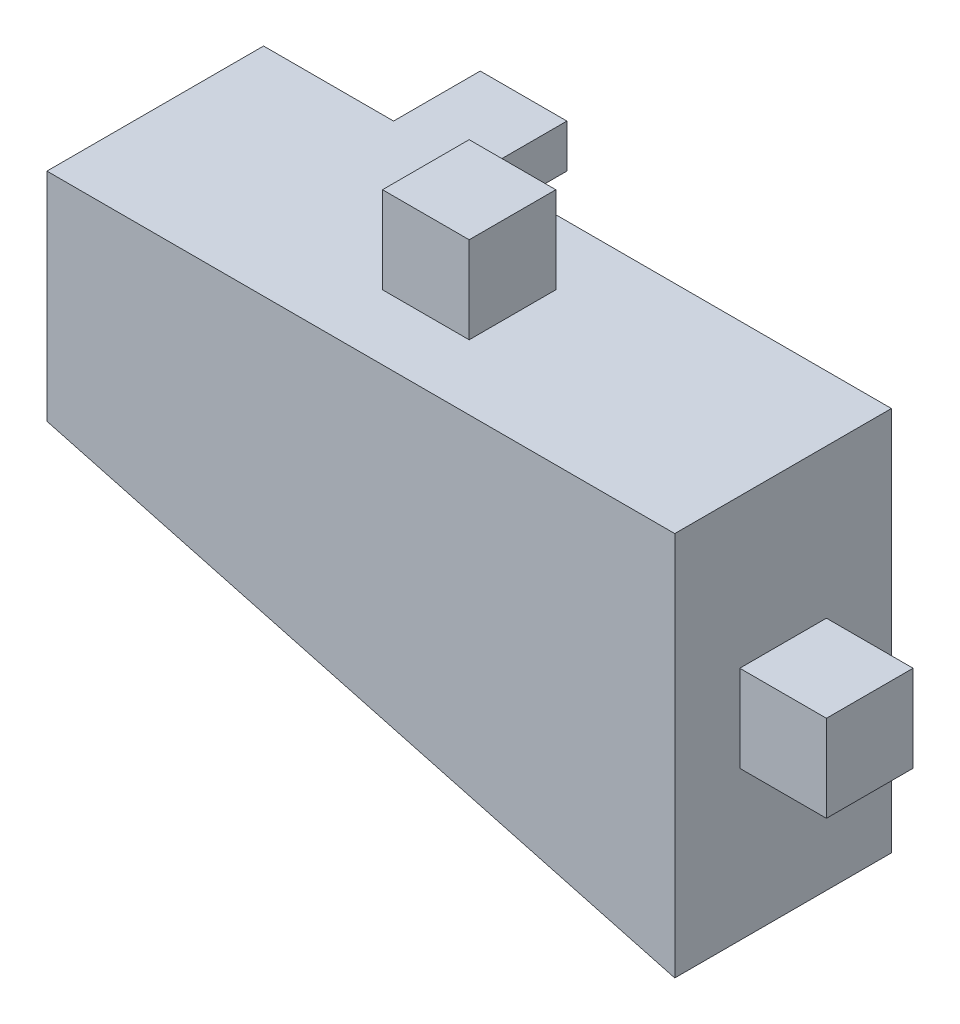
ISO-10303-21;
HEADER;
FILE_DESCRIPTION(('STEP AP214'),'2;1');
FILE_NAME('part.step','',(''),(''),'','','');
FILE_SCHEMA(('AUTOMOTIVE_DESIGN { 1 0 10303 214 1 1 1 1 }'));
ENDSEC;
DATA;
#1=APPLICATION_CONTEXT('core data for automotive mechanical design processes');
#2=APPLICATION_PROTOCOL_DEFINITION('international standard','automotive_design',2000,#1);
#3=PRODUCT_CONTEXT('',#1,'mechanical');
#4=PRODUCT('Part','Part','',(#3));
#5=PRODUCT_RELATED_PRODUCT_CATEGORY('part','',(#4));
#6=PRODUCT_DEFINITION_FORMATION('','',#4);
#7=PRODUCT_DEFINITION_CONTEXT('part definition',#1,'design');
#8=PRODUCT_DEFINITION('design','',#6,#7);
#9=PRODUCT_DEFINITION_SHAPE('','',#8);
#10=(LENGTH_UNIT() NAMED_UNIT(*) SI_UNIT(.MILLI.,.METRE.));
#11=(NAMED_UNIT(*) PLANE_ANGLE_UNIT() SI_UNIT($,.RADIAN.));
#12=(NAMED_UNIT(*) SI_UNIT($,.STERADIAN.) SOLID_ANGLE_UNIT());
#13=UNCERTAINTY_MEASURE_WITH_UNIT(LENGTH_MEASURE(1.E-05),#10,'distance_accuracy_value','');
#14=(GEOMETRIC_REPRESENTATION_CONTEXT(3) GLOBAL_UNCERTAINTY_ASSIGNED_CONTEXT((#13)) GLOBAL_UNIT_ASSIGNED_CONTEXT((#10,
#11,#12)) REPRESENTATION_CONTEXT('',''));
#15=CARTESIAN_POINT('',(0.,0.,0.));
#16=DIRECTION('',(0.,0.,1.));
#17=DIRECTION('',(1.,0.,0.));
#18=AXIS2_PLACEMENT_3D('',#15,#16,#17);
#19=CARTESIAN_POINT('',(110.57764421791,0.,0.));
#20=DIRECTION('',(-1.,0.,0.));
#21=DIRECTION('',(0.,-1.,0.));
#22=AXIS2_PLACEMENT_3D('',#19,#20,#21);
#23=PLANE('',#22);
#24=DIRECTION('',(0.,-1.,0.));
#25=VECTOR('',#24,1.);
#26=CARTESIAN_POINT('',(110.57764421791,31.6424845178765,50.));
#27=LINE('',#26,#25);
#28=CARTESIAN_POINT('',(110.57764421791,-18.2414554532318,50.));
#29=VERTEX_POINT('',#28);
#30=CARTESIAN_POINT('',(110.57764421791,-107.064312218609,50.));
#31=VERTEX_POINT('',#30);
#32=EDGE_CURVE('E47',#29,#31,#27,.T.);
#33=ORIENTED_EDGE('',*,*,#32,.T.);
#34=DIRECTION('',(0.,0.,-1.));
#35=VECTOR('',#34,1.);
#36=CARTESIAN_POINT('',(110.57764421791,-107.064312218609,50.));
#37=LINE('',#36,#35);
#38=CARTESIAN_POINT('',(110.57764421791,-107.064312218609,0.));
#39=VERTEX_POINT('',#38);
#40=EDGE_CURVE('E11',#31,#39,#37,.T.);
#41=ORIENTED_EDGE('',*,*,#40,.T.);
#42=DIRECTION('',(0.,-1.,0.));
#43=VECTOR('',#42,1.);
#44=CARTESIAN_POINT('',(110.57764421791,31.7585445467682,0.));
#45=LINE('',#44,#43);
#46=CARTESIAN_POINT('',(110.57764421791,-18.2414554532318,0.));
#47=VERTEX_POINT('',#46);
#48=EDGE_CURVE('E260',#47,#39,#45,.T.);
#49=ORIENTED_EDGE('',*,*,#48,.F.);
#50=DIRECTION('',(0.,0.,-1.));
#51=VECTOR('',#50,1.);
#52=CARTESIAN_POINT('',(110.57764421791,-18.2414554532318,0.));
#53=LINE('',#52,#51);
#54=EDGE_CURVE('E42',#29,#47,#53,.T.);
#55=ORIENTED_EDGE('',*,*,#54,.F.);
#56=EDGE_LOOP('',(#33,#41,#49,#55));
#57=FACE_BOUND('',#56,.T.);
#58=DIRECTION('',(0.,-1.,0.));
#59=VECTOR('',#58,1.);
#60=CARTESIAN_POINT('',(110.57764421791,-52.6528838359203,35.0000000000001));
#61=LINE('',#60,#59);
#62=CARTESIAN_POINT('',(110.57764421791,-52.6528838359203,35.0000000000001));
#63=VERTEX_POINT('',#62);
#64=CARTESIAN_POINT('',(110.57764421791,-72.6528838359204,35.0000000000001));
#65=VERTEX_POINT('',#64);
#66=EDGE_CURVE('E55',#63,#65,#61,.T.);
#67=ORIENTED_EDGE('',*,*,#66,.F.);
#68=DIRECTION('',(0.,0.,1.));
#69=VECTOR('',#68,1.);
#70=CARTESIAN_POINT('',(110.57764421791,-52.6528838359203,35.0000000000001));
#71=LINE('',#70,#69);
#72=CARTESIAN_POINT('',(110.57764421791,-52.6528838359203,15.0000000000001));
#73=VERTEX_POINT('',#72);
#74=EDGE_CURVE('E59',#73,#63,#71,.T.);
#75=ORIENTED_EDGE('',*,*,#74,.F.);
#76=DIRECTION('',(0.,1.,0.));
#77=VECTOR('',#76,1.);
#78=CARTESIAN_POINT('',(110.57764421791,-52.6528838359203,15.0000000000001));
#79=LINE('',#78,#77);
#80=CARTESIAN_POINT('',(110.57764421791,-72.6528838359204,15.0000000000001));
#81=VERTEX_POINT('',#80);
#82=EDGE_CURVE('E462',#81,#73,#79,.T.);
#83=ORIENTED_EDGE('',*,*,#82,.F.);
#84=DIRECTION('',(0.,0.,-1.));
#85=VECTOR('',#84,1.);
#86=CARTESIAN_POINT('',(110.57764421791,-72.6528838359204,35.0000000000001));
#87=LINE('',#86,#85);
#88=EDGE_CURVE('E468',#65,#81,#87,.T.);
#89=ORIENTED_EDGE('',*,*,#88,.F.);
#90=EDGE_LOOP('',(#67,#75,#83,#89));
#91=FACE_BOUND('',#90,.T.);
#92=ADVANCED_FACE('F39',(#57,#91),#23,.F.);
#93=CARTESIAN_POINT('',(45.6887702745492,31.6424845178765,50.));
#94=DIRECTION('',(0.,0.,1.));
#95=DIRECTION('',(1.,0.,0.));
#96=AXIS2_PLACEMENT_3D('',#93,#94,#95);
#97=PLANE('',#96);
#98=ORIENTED_EDGE('',*,*,#32,.F.);
#99=DIRECTION('',(1.,0.,0.));
#100=VECTOR('',#99,1.);
#101=CARTESIAN_POINT('',(45.6887702745492,-18.2414554532318,50.));
#102=LINE('',#101,#100);
#103=CARTESIAN_POINT('',(-34.3112297254508,-18.2414554532318,50.));
#104=VERTEX_POINT('',#103);
#105=EDGE_CURVE('E257',#104,#29,#102,.T.);
#106=ORIENTED_EDGE('',*,*,#105,.F.);
#107=DIRECTION('',(0.,1.,0.));
#108=VECTOR('',#107,1.);
#109=CARTESIAN_POINT('',(-34.3112297254508,-68.2414554532319,50.));
#110=LINE('',#109,#108);
#111=CARTESIAN_POINT('',(-34.3112297254508,-68.2414554532319,50.));
#112=VERTEX_POINT('',#111);
#113=EDGE_CURVE('E239',#112,#104,#110,.T.);
#114=ORIENTED_EDGE('',*,*,#113,.F.);
#115=DIRECTION('',(-0.96592582628907,0.258819045102514,0.));
#116=VECTOR('',#115,1.);
#117=CARTESIAN_POINT('',(-34.3112297254508,-68.2414554532319,50.));
#118=LINE('',#117,#116);
#119=EDGE_CURVE('E248',#31,#112,#118,.T.);
#120=ORIENTED_EDGE('',*,*,#119,.F.);
#121=EDGE_LOOP('',(#98,#106,#114,#120));
#122=FACE_BOUND('',#121,.T.);
#123=ADVANCED_FACE('F299',(#122),#97,.T.);
#124=CARTESIAN_POINT('',(-34.3112297254508,-68.3575154821235,750.));
#125=DIRECTION('',(1.,0.,0.));
#126=DIRECTION('',(0.,1.,0.));
#127=AXIS2_PLACEMENT_3D('',#124,#125,#126);
#128=PLANE('',#127);
#129=ORIENTED_EDGE('',*,*,#113,.T.);
#130=DIRECTION('',(0.,0.,-1.));
#131=VECTOR('',#130,1.);
#132=CARTESIAN_POINT('',(-34.3112297254508,-18.2414554532318,750.));
#133=LINE('',#132,#131);
#134=CARTESIAN_POINT('',(-34.3112297254508,-18.2414554532318,0.));
#135=VERTEX_POINT('',#134);
#136=EDGE_CURVE('E255',#104,#135,#133,.T.);
#137=ORIENTED_EDGE('',*,*,#136,.T.);
#138=DIRECTION('',(0.,-1.,0.));
#139=VECTOR('',#138,1.);
#140=CARTESIAN_POINT('',(-34.3112297254508,31.7585445467682,0.));
#141=LINE('',#140,#139);
#142=CARTESIAN_POINT('',(-34.3112297254508,-68.2414554532319,0.));
#143=VERTEX_POINT('',#142);
#144=EDGE_CURVE('E245',#135,#143,#141,.T.);
#145=ORIENTED_EDGE('',*,*,#144,.T.);
#146=DIRECTION('',(0.,0.,1.));
#147=VECTOR('',#146,1.);
#148=CARTESIAN_POINT('',(-34.3112297254508,-68.2414554532319,0.));
#149=LINE('',#148,#147);
#150=EDGE_CURVE('E242',#143,#112,#149,.T.);
#151=ORIENTED_EDGE('',*,*,#150,.T.);
#152=EDGE_LOOP('',(#129,#137,#145,#151));
#153=FACE_BOUND('',#152,.T.);
#154=ADVANCED_FACE('F294',(#153),#128,.F.);
#155=CARTESIAN_POINT('',(-34.3112297254508,-68.2414554532319,50.));
#156=DIRECTION('',(-0.258819045102514,-0.96592582628907,0.));
#157=DIRECTION('',(0.96592582628907,-0.258819045102514,0.));
#158=AXIS2_PLACEMENT_3D('',#155,#156,#157);
#159=PLANE('',#158);
#160=ORIENTED_EDGE('',*,*,#40,.F.);
#161=ORIENTED_EDGE('',*,*,#119,.T.);
#162=ORIENTED_EDGE('',*,*,#150,.F.);
#163=DIRECTION('',(-0.96592582628907,0.258819045102514,0.));
#164=VECTOR('',#163,1.);
#165=CARTESIAN_POINT('',(-34.3112297254508,-68.2414554532319,0.));
#166=LINE('',#165,#164);
#167=EDGE_CURVE('E249',#39,#143,#166,.T.);
#168=ORIENTED_EDGE('',*,*,#167,.F.);
#169=EDGE_LOOP('',(#160,#161,#162,#168));
#170=FACE_BOUND('',#169,.T.);
#171=ADVANCED_FACE('F296',(#170),#159,.T.);
#172=CARTESIAN_POINT('',(0.,-18.2414554532318,0.));
#173=DIRECTION('',(0.,-1.,0.));
#174=DIRECTION('',(1.,0.,0.));
#175=AXIS2_PLACEMENT_3D('',#172,#173,#174);
#176=PLANE('',#175);
#177=DIRECTION('',(1.,0.,0.));
#178=VECTOR('',#177,1.);
#179=CARTESIAN_POINT('',(0.,-18.2414554532318,15.));
#180=LINE('',#179,#178);
#181=CARTESIAN_POINT('',(28.1332072462295,-18.2414554532318,15.));
#182=VERTEX_POINT('',#181);
#183=CARTESIAN_POINT('',(48.1332072462295,-18.2414554532318,15.));
#184=VERTEX_POINT('',#183);
#185=EDGE_CURVE('E221',#182,#184,#180,.T.);
#186=ORIENTED_EDGE('',*,*,#185,.T.);
#187=DIRECTION('',(0.,0.,1.));
#188=VECTOR('',#187,1.);
#189=CARTESIAN_POINT('',(48.1332072462295,-18.2414554532318,0.));
#190=LINE('',#189,#188);
#191=CARTESIAN_POINT('',(48.1332072462295,-18.2414554532318,35.));
#192=VERTEX_POINT('',#191);
#193=EDGE_CURVE('E207',#184,#192,#190,.T.);
#194=ORIENTED_EDGE('',*,*,#193,.T.);
#195=DIRECTION('',(1.,0.,0.));
#196=VECTOR('',#195,1.);
#197=CARTESIAN_POINT('',(0.,-18.2414554532318,35.));
#198=LINE('',#197,#196);
#199=CARTESIAN_POINT('',(28.1332072462295,-18.2414554532318,35.));
#200=VERTEX_POINT('',#199);
#201=EDGE_CURVE('E212',#200,#192,#198,.T.);
#202=ORIENTED_EDGE('',*,*,#201,.F.);
#203=DIRECTION('',(0.,0.,1.));
#204=VECTOR('',#203,1.);
#205=CARTESIAN_POINT('',(28.1332072462295,-18.2414554532318,0.));
#206=LINE('',#205,#204);
#207=EDGE_CURVE('E223',#182,#200,#206,.T.);
#208=ORIENTED_EDGE('',*,*,#207,.F.);
#209=EDGE_LOOP('',(#186,#194,#202,#208));
#210=FACE_BOUND('',#209,.T.);
#211=ORIENTED_EDGE('',*,*,#105,.T.);
#212=ORIENTED_EDGE('',*,*,#54,.T.);
#213=DIRECTION('',(1.,0.,0.));
#214=VECTOR('',#213,1.);
#215=CARTESIAN_POINT('',(-34.3112297254508,-18.2414554532318,0.));
#216=LINE('',#215,#214);
#217=CARTESIAN_POINT('',(15.6887702745492,-18.2414554532318,0.));
#218=VERTEX_POINT('',#217);
#219=EDGE_CURVE('E251',#218,#47,#216,.T.);
#220=ORIENTED_EDGE('',*,*,#219,.F.);
#221=DIRECTION('',(0.,0.,1.));
#222=VECTOR('',#221,1.);
#223=CARTESIAN_POINT('',(15.6887702745492,-18.2414554532318,-20.));
#224=LINE('',#223,#222);
#225=CARTESIAN_POINT('',(15.6887702745492,-18.2414554532318,-20.));
#226=VERTEX_POINT('',#225);
#227=EDGE_CURVE('E201',#226,#218,#224,.T.);
#228=ORIENTED_EDGE('',*,*,#227,.F.);
#229=DIRECTION('',(1.,0.,0.));
#230=VECTOR('',#229,1.);
#231=CARTESIAN_POINT('',(0.,-18.2414554532318,-20.));
#232=LINE('',#231,#230);
#233=CARTESIAN_POINT('',(-4.31122972545079,-18.2414554532318,-20.));
#234=VERTEX_POINT('',#233);
#235=EDGE_CURVE('E184',#234,#226,#232,.T.);
#236=ORIENTED_EDGE('',*,*,#235,.F.);
#237=DIRECTION('',(0.,0.,1.));
#238=VECTOR('',#237,1.);
#239=CARTESIAN_POINT('',(-4.31122972545079,-18.2414554532318,-20.));
#240=LINE('',#239,#238);
#241=CARTESIAN_POINT('',(-4.3112297254508,-18.2414554532318,0.));
#242=VERTEX_POINT('',#241);
#243=EDGE_CURVE('E204',#234,#242,#240,.T.);
#244=ORIENTED_EDGE('',*,*,#243,.T.);
#245=EDGE_CURVE('E253',#135,#242,#216,.T.);
#246=ORIENTED_EDGE('',*,*,#245,.F.);
#247=ORIENTED_EDGE('',*,*,#136,.F.);
#248=EDGE_LOOP('',(#211,#212,#220,#228,#236,#244,#246,#247));
#249=FACE_BOUND('',#248,.T.);
#250=ADVANCED_FACE('F269',(#210,#249),#176,.F.);
#251=CARTESIAN_POINT('',(-34.3112297254508,31.7585445467682,0.));
#252=DIRECTION('',(0.,0.,1.));
#253=DIRECTION('',(1.,0.,0.));
#254=AXIS2_PLACEMENT_3D('',#251,#252,#253);
#255=PLANE('',#254);
#256=ORIENTED_EDGE('',*,*,#245,.T.);
#257=DIRECTION('',(0.,-1.,0.));
#258=VECTOR('',#257,1.);
#259=CARTESIAN_POINT('',(-4.31122972545079,0.,0.));
#260=LINE('',#259,#258);
#261=CARTESIAN_POINT('',(-4.3112297254508,-28.2414554532318,0.));
#262=VERTEX_POINT('',#261);
#263=EDGE_CURVE('E173',#242,#262,#260,.T.);
#264=ORIENTED_EDGE('',*,*,#263,.T.);
#265=DIRECTION('',(-1.,0.,0.));
#266=VECTOR('',#265,1.);
#267=CARTESIAN_POINT('',(0.,-28.2414554532318,0.));
#268=LINE('',#267,#266);
#269=CARTESIAN_POINT('',(15.6887702745492,-28.2414554532318,0.));
#270=VERTEX_POINT('',#269);
#271=EDGE_CURVE('E185',#270,#262,#268,.T.);
#272=ORIENTED_EDGE('',*,*,#271,.F.);
#273=DIRECTION('',(0.,-1.,0.));
#274=VECTOR('',#273,1.);
#275=CARTESIAN_POINT('',(15.6887702745492,0.,0.));
#276=LINE('',#275,#274);
#277=EDGE_CURVE('E175',#218,#270,#276,.T.);
#278=ORIENTED_EDGE('',*,*,#277,.F.);
#279=ORIENTED_EDGE('',*,*,#219,.T.);
#280=ORIENTED_EDGE('',*,*,#48,.T.);
#281=ORIENTED_EDGE('',*,*,#167,.T.);
#282=ORIENTED_EDGE('',*,*,#144,.F.);
#283=EDGE_LOOP('',(#256,#264,#272,#278,#279,#280,#281,#282));
#284=FACE_BOUND('',#283,.T.);
#285=ADVANCED_FACE('F274',(#284),#255,.F.);
#286=CARTESIAN_POINT('',(48.1332072462295,1.75854454676817,0.));
#287=DIRECTION('',(1.,0.,0.));
#288=DIRECTION('',(0.,1.,0.));
#289=AXIS2_PLACEMENT_3D('',#286,#287,#288);
#290=PLANE('',#289);
#291=ORIENTED_EDGE('',*,*,#193,.F.);
#292=DIRECTION('',(0.,-1.,0.));
#293=VECTOR('',#292,1.);
#294=CARTESIAN_POINT('',(48.1332072462295,1.75854454676817,15.));
#295=LINE('',#294,#293);
#296=CARTESIAN_POINT('',(48.1332072462295,1.75854454676817,15.));
#297=VERTEX_POINT('',#296);
#298=EDGE_CURVE('E236',#297,#184,#295,.T.);
#299=ORIENTED_EDGE('',*,*,#298,.F.);
#300=DIRECTION('',(0.,0.,1.));
#301=VECTOR('',#300,1.);
#302=CARTESIAN_POINT('',(48.1332072462295,1.75854454676817,0.));
#303=LINE('',#302,#301);
#304=CARTESIAN_POINT('',(48.1332072462295,1.75854454676817,35.));
#305=VERTEX_POINT('',#304);
#306=EDGE_CURVE('E208',#297,#305,#303,.T.);
#307=ORIENTED_EDGE('',*,*,#306,.T.);
#308=DIRECTION('',(0.,-1.,0.));
#309=VECTOR('',#308,1.);
#310=CARTESIAN_POINT('',(48.1332072462295,1.75854454676817,35.));
#311=LINE('',#310,#309);
#312=EDGE_CURVE('E219',#305,#192,#311,.T.);
#313=ORIENTED_EDGE('',*,*,#312,.T.);
#314=EDGE_LOOP('',(#291,#299,#307,#313));
#315=FACE_BOUND('',#314,.T.);
#316=ADVANCED_FACE('F302',(#315),#290,.T.);
#317=CARTESIAN_POINT('',(0.,1.75854454676816,15.));
#318=DIRECTION('',(0.,0.,-1.));
#319=DIRECTION('',(-1.,0.,0.));
#320=AXIS2_PLACEMENT_3D('',#317,#318,#319);
#321=PLANE('',#320);
#322=ORIENTED_EDGE('',*,*,#185,.F.);
#323=DIRECTION('',(0.,-1.,0.));
#324=VECTOR('',#323,1.);
#325=CARTESIAN_POINT('',(28.1332072462295,1.75854454676816,15.));
#326=LINE('',#325,#324);
#327=CARTESIAN_POINT('',(28.1332072462295,1.75854454676816,15.));
#328=VERTEX_POINT('',#327);
#329=EDGE_CURVE('E233',#328,#182,#326,.T.);
#330=ORIENTED_EDGE('',*,*,#329,.F.);
#331=DIRECTION('',(1.,0.,0.));
#332=VECTOR('',#331,1.);
#333=CARTESIAN_POINT('',(0.,1.75854454676816,15.));
#334=LINE('',#333,#332);
#335=EDGE_CURVE('E211',#328,#297,#334,.T.);
#336=ORIENTED_EDGE('',*,*,#335,.T.);
#337=ORIENTED_EDGE('',*,*,#298,.T.);
#338=EDGE_LOOP('',(#322,#330,#336,#337));
#339=FACE_BOUND('',#338,.T.);
#340=ADVANCED_FACE('F312',(#339),#321,.T.);
#341=CARTESIAN_POINT('',(28.1332072462295,1.75854454676816,0.));
#342=DIRECTION('',(1.,0.,0.));
#343=DIRECTION('',(0.,0.,-1.));
#344=AXIS2_PLACEMENT_3D('',#341,#342,#343);
#345=PLANE('',#344);
#346=ORIENTED_EDGE('',*,*,#207,.T.);
#347=DIRECTION('',(0.,-1.,0.));
#348=VECTOR('',#347,1.);
#349=CARTESIAN_POINT('',(28.1332072462295,1.75854454676816,35.));
#350=LINE('',#349,#348);
#351=CARTESIAN_POINT('',(28.1332072462295,1.75854454676816,35.));
#352=VERTEX_POINT('',#351);
#353=EDGE_CURVE('E230',#352,#200,#350,.T.);
#354=ORIENTED_EDGE('',*,*,#353,.F.);
#355=DIRECTION('',(0.,0.,1.));
#356=VECTOR('',#355,1.);
#357=CARTESIAN_POINT('',(28.1332072462295,1.75854454676816,0.));
#358=LINE('',#357,#356);
#359=EDGE_CURVE('E215',#328,#352,#358,.T.);
#360=ORIENTED_EDGE('',*,*,#359,.F.);
#361=ORIENTED_EDGE('',*,*,#329,.T.);
#362=EDGE_LOOP('',(#346,#354,#360,#361));
#363=FACE_BOUND('',#362,.T.);
#364=ADVANCED_FACE('F319',(#363),#345,.F.);
#365=CARTESIAN_POINT('',(0.,1.75854454676816,35.));
#366=DIRECTION('',(0.,0.,-1.));
#367=DIRECTION('',(-1.,0.,0.));
#368=AXIS2_PLACEMENT_3D('',#365,#366,#367);
#369=PLANE('',#368);
#370=ORIENTED_EDGE('',*,*,#201,.T.);
#371=ORIENTED_EDGE('',*,*,#312,.F.);
#372=DIRECTION('',(1.,0.,0.));
#373=VECTOR('',#372,1.);
#374=CARTESIAN_POINT('',(0.,1.75854454676816,35.));
#375=LINE('',#374,#373);
#376=EDGE_CURVE('E217',#352,#305,#375,.T.);
#377=ORIENTED_EDGE('',*,*,#376,.F.);
#378=ORIENTED_EDGE('',*,*,#353,.T.);
#379=EDGE_LOOP('',(#370,#371,#377,#378));
#380=FACE_BOUND('',#379,.T.);
#381=ADVANCED_FACE('F338',(#380),#369,.F.);
#382=CARTESIAN_POINT('',(0.,1.75854454676816,0.));
#383=DIRECTION('',(0.,1.,0.));
#384=DIRECTION('',(-1.,0.,0.));
#385=AXIS2_PLACEMENT_3D('',#382,#383,#384);
#386=PLANE('',#385);
#387=ORIENTED_EDGE('',*,*,#306,.F.);
#388=ORIENTED_EDGE('',*,*,#335,.F.);
#389=ORIENTED_EDGE('',*,*,#359,.T.);
#390=ORIENTED_EDGE('',*,*,#376,.T.);
#391=EDGE_LOOP('',(#387,#388,#389,#390));
#392=FACE_BOUND('',#391,.T.);
#393=ADVANCED_FACE('F343',(#392),#386,.T.);
#394=CARTESIAN_POINT('',(-4.31122972545079,0.,-20.));
#395=DIRECTION('',(-1.,0.,0.));
#396=DIRECTION('',(0.,-1.,0.));
#397=AXIS2_PLACEMENT_3D('',#394,#395,#396);
#398=PLANE('',#397);
#399=ORIENTED_EDGE('',*,*,#263,.F.);
#400=ORIENTED_EDGE('',*,*,#243,.F.);
#401=DIRECTION('',(0.,-1.,0.));
#402=VECTOR('',#401,1.);
#403=CARTESIAN_POINT('',(-4.31122972545079,0.,-20.));
#404=LINE('',#403,#402);
#405=CARTESIAN_POINT('',(-4.3112297254508,-28.2414554532318,-20.));
#406=VERTEX_POINT('',#405);
#407=EDGE_CURVE('E181',#234,#406,#404,.T.);
#408=ORIENTED_EDGE('',*,*,#407,.T.);
#409=DIRECTION('',(0.,0.,1.));
#410=VECTOR('',#409,1.);
#411=CARTESIAN_POINT('',(-4.3112297254508,-28.2414554532318,-20.));
#412=LINE('',#411,#410);
#413=EDGE_CURVE('E190',#406,#262,#412,.T.);
#414=ORIENTED_EDGE('',*,*,#413,.T.);
#415=EDGE_LOOP('',(#399,#400,#408,#414));
#416=FACE_BOUND('',#415,.T.);
#417=ADVANCED_FACE('F291',(#416),#398,.T.);
#418=CARTESIAN_POINT('',(15.6887702745492,0.,-20.));
#419=DIRECTION('',(-1.,0.,0.));
#420=DIRECTION('',(0.,-1.,0.));
#421=AXIS2_PLACEMENT_3D('',#418,#419,#420);
#422=PLANE('',#421);
#423=ORIENTED_EDGE('',*,*,#277,.T.);
#424=DIRECTION('',(0.,0.,1.));
#425=VECTOR('',#424,1.);
#426=CARTESIAN_POINT('',(15.6887702745492,-28.2414554532318,-20.));
#427=LINE('',#426,#425);
#428=CARTESIAN_POINT('',(15.6887702745492,-28.2414554532318,-20.));
#429=VERTEX_POINT('',#428);
#430=EDGE_CURVE('E198',#429,#270,#427,.T.);
#431=ORIENTED_EDGE('',*,*,#430,.F.);
#432=DIRECTION('',(0.,-1.,0.));
#433=VECTOR('',#432,1.);
#434=CARTESIAN_POINT('',(15.6887702745492,0.,-20.));
#435=LINE('',#434,#433);
#436=EDGE_CURVE('E187',#226,#429,#435,.T.);
#437=ORIENTED_EDGE('',*,*,#436,.F.);
#438=ORIENTED_EDGE('',*,*,#227,.T.);
#439=EDGE_LOOP('',(#423,#431,#437,#438));
#440=FACE_BOUND('',#439,.T.);
#441=ADVANCED_FACE('F278',(#440),#422,.F.);
#442=CARTESIAN_POINT('',(0.,-28.2414554532318,-20.));
#443=DIRECTION('',(0.,1.,0.));
#444=DIRECTION('',(0.,0.,1.));
#445=AXIS2_PLACEMENT_3D('',#442,#443,#444);
#446=PLANE('',#445);
#447=ORIENTED_EDGE('',*,*,#271,.T.);
#448=ORIENTED_EDGE('',*,*,#413,.F.);
#449=DIRECTION('',(-1.,0.,0.));
#450=VECTOR('',#449,1.);
#451=CARTESIAN_POINT('',(0.,-28.2414554532318,-20.));
#452=LINE('',#451,#450);
#453=EDGE_CURVE('E189',#429,#406,#452,.T.);
#454=ORIENTED_EDGE('',*,*,#453,.F.);
#455=ORIENTED_EDGE('',*,*,#430,.T.);
#456=EDGE_LOOP('',(#447,#448,#454,#455));
#457=FACE_BOUND('',#456,.T.);
#458=ADVANCED_FACE('F282',(#457),#446,.F.);
#459=CARTESIAN_POINT('',(0.,0.,-20.));
#460=DIRECTION('',(0.,0.,-1.));
#461=DIRECTION('',(-1.,0.,0.));
#462=AXIS2_PLACEMENT_3D('',#459,#460,#461);
#463=PLANE('',#462);
#464=ORIENTED_EDGE('',*,*,#407,.F.);
#465=ORIENTED_EDGE('',*,*,#235,.T.);
#466=ORIENTED_EDGE('',*,*,#436,.T.);
#467=ORIENTED_EDGE('',*,*,#453,.T.);
#468=EDGE_LOOP('',(#464,#465,#466,#467));
#469=FACE_BOUND('',#468,.T.);
#470=ADVANCED_FACE('F286',(#469),#463,.T.);
#471=CARTESIAN_POINT('',(130.57764421791,-52.6528838359203,35.0000000000001));
#472=DIRECTION('',(0.,0.,-1.));
#473=DIRECTION('',(-1.,0.,0.));
#474=AXIS2_PLACEMENT_3D('',#471,#472,#473);
#475=PLANE('',#474);
#476=ORIENTED_EDGE('',*,*,#66,.T.);
#477=DIRECTION('',(-1.,0.,0.));
#478=VECTOR('',#477,1.);
#479=CARTESIAN_POINT('',(130.57764421791,-72.6528838359204,35.0000000000001));
#480=LINE('',#479,#478);
#481=CARTESIAN_POINT('',(130.57764421791,-72.6528838359204,35.0000000000001));
#482=VERTEX_POINT('',#481);
#483=EDGE_CURVE('E156',#482,#65,#480,.T.);
#484=ORIENTED_EDGE('',*,*,#483,.F.);
#485=DIRECTION('',(0.,-1.,0.));
#486=VECTOR('',#485,1.);
#487=CARTESIAN_POINT('',(130.57764421791,-52.6528838359203,35.0000000000001));
#488=LINE('',#487,#486);
#489=CARTESIAN_POINT('',(130.57764421791,-52.6528838359203,35.0000000000001));
#490=VERTEX_POINT('',#489);
#491=EDGE_CURVE('E162',#490,#482,#488,.T.);
#492=ORIENTED_EDGE('',*,*,#491,.F.);
#493=DIRECTION('',(-1.,0.,0.));
#494=VECTOR('',#493,1.);
#495=CARTESIAN_POINT('',(130.57764421791,-52.6528838359203,35.0000000000001));
#496=LINE('',#495,#494);
#497=EDGE_CURVE('E460',#490,#63,#496,.T.);
#498=ORIENTED_EDGE('',*,*,#497,.T.);
#499=EDGE_LOOP('',(#476,#484,#492,#498));
#500=FACE_BOUND('',#499,.T.);
#501=ADVANCED_FACE('F172',(#500),#475,.F.);
#502=CARTESIAN_POINT('',(130.57764421791,-72.6528838359204,35.0000000000001));
#503=DIRECTION('',(0.,1.,0.));
#504=DIRECTION('',(-1.,0.,0.));
#505=AXIS2_PLACEMENT_3D('',#502,#503,#504);
#506=PLANE('',#505);
#507=ORIENTED_EDGE('',*,*,#88,.T.);
#508=DIRECTION('',(-1.,0.,0.));
#509=VECTOR('',#508,1.);
#510=CARTESIAN_POINT('',(130.57764421791,-72.6528838359204,15.0000000000001));
#511=LINE('',#510,#509);
#512=CARTESIAN_POINT('',(130.57764421791,-72.6528838359204,15.0000000000001));
#513=VERTEX_POINT('',#512);
#514=EDGE_CURVE('E158',#513,#81,#511,.T.);
#515=ORIENTED_EDGE('',*,*,#514,.F.);
#516=DIRECTION('',(0.,0.,-1.));
#517=VECTOR('',#516,1.);
#518=CARTESIAN_POINT('',(130.57764421791,-72.6528838359204,35.0000000000001));
#519=LINE('',#518,#517);
#520=EDGE_CURVE('E151',#482,#513,#519,.T.);
#521=ORIENTED_EDGE('',*,*,#520,.F.);
#522=ORIENTED_EDGE('',*,*,#483,.T.);
#523=EDGE_LOOP('',(#507,#515,#521,#522));
#524=FACE_BOUND('',#523,.T.);
#525=ADVANCED_FACE('F154',(#524),#506,.F.);
#526=CARTESIAN_POINT('',(130.57764421791,-52.6528838359203,15.0000000000001));
#527=DIRECTION('',(0.,0.,1.));
#528=DIRECTION('',(0.,-1.,0.));
#529=AXIS2_PLACEMENT_3D('',#526,#527,#528);
#530=PLANE('',#529);
#531=ORIENTED_EDGE('',*,*,#82,.T.);
#532=DIRECTION('',(-1.,0.,0.));
#533=VECTOR('',#532,1.);
#534=CARTESIAN_POINT('',(130.57764421791,-52.6528838359203,15.0000000000001));
#535=LINE('',#534,#533);
#536=CARTESIAN_POINT('',(130.57764421791,-52.6528838359203,15.0000000000001));
#537=VERTEX_POINT('',#536);
#538=EDGE_CURVE('E177',#537,#73,#535,.T.);
#539=ORIENTED_EDGE('',*,*,#538,.F.);
#540=DIRECTION('',(0.,1.,0.));
#541=VECTOR('',#540,1.);
#542=CARTESIAN_POINT('',(130.57764421791,-52.6528838359203,15.0000000000001));
#543=LINE('',#542,#541);
#544=EDGE_CURVE('E161',#513,#537,#543,.T.);
#545=ORIENTED_EDGE('',*,*,#544,.F.);
#546=ORIENTED_EDGE('',*,*,#514,.T.);
#547=EDGE_LOOP('',(#531,#539,#545,#546));
#548=FACE_BOUND('',#547,.T.);
#549=ADVANCED_FACE('F428',(#548),#530,.F.);
#550=CARTESIAN_POINT('',(130.57764421791,-52.6528838359203,35.0000000000001));
#551=DIRECTION('',(0.,-1.,0.));
#552=DIRECTION('',(1.,0.,0.));
#553=AXIS2_PLACEMENT_3D('',#550,#551,#552);
#554=PLANE('',#553);
#555=ORIENTED_EDGE('',*,*,#74,.T.);
#556=ORIENTED_EDGE('',*,*,#497,.F.);
#557=DIRECTION('',(0.,0.,1.));
#558=VECTOR('',#557,1.);
#559=CARTESIAN_POINT('',(130.57764421791,-52.6528838359203,35.0000000000001));
#560=LINE('',#559,#558);
#561=EDGE_CURVE('E167',#537,#490,#560,.T.);
#562=ORIENTED_EDGE('',*,*,#561,.F.);
#563=ORIENTED_EDGE('',*,*,#538,.T.);
#564=EDGE_LOOP('',(#555,#556,#562,#563));
#565=FACE_BOUND('',#564,.T.);
#566=ADVANCED_FACE('F437',(#565),#554,.F.);
#567=CARTESIAN_POINT('',(130.57764421791,0.,0.));
#568=DIRECTION('',(1.,0.,0.));
#569=DIRECTION('',(0.,1.,0.));
#570=AXIS2_PLACEMENT_3D('',#567,#568,#569);
#571=PLANE('',#570);
#572=ORIENTED_EDGE('',*,*,#491,.T.);
#573=ORIENTED_EDGE('',*,*,#520,.T.);
#574=ORIENTED_EDGE('',*,*,#544,.T.);
#575=ORIENTED_EDGE('',*,*,#561,.T.);
#576=EDGE_LOOP('',(#572,#573,#574,#575));
#577=FACE_BOUND('',#576,.T.);
#578=ADVANCED_FACE('F165',(#577),#571,.T.);
#579=CLOSED_SHELL('',(#92,#123,#154,#171,#250,#285,#316,#340,#364,#381,#393,#417,#441,#458,#470,
#501,#525,#549,#566,#578));
#580=MANIFOLD_SOLID_BREP('B2',#579);
#581=ADVANCED_BREP_SHAPE_REPRESENTATION('',(#18,#580),#14);
#582=SHAPE_DEFINITION_REPRESENTATION(#9,#581);
ENDSEC;
END-ISO-10303-21;
